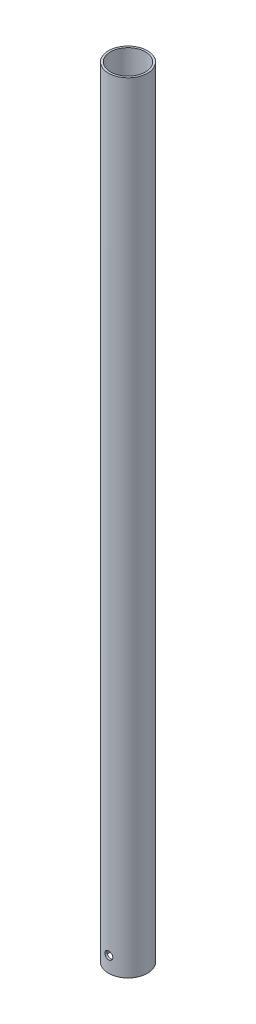
ISO-10303-21;
HEADER;
FILE_DESCRIPTION(('STEP AP214'),'2;1');
FILE_NAME('part.step','',(''),(''),'','','');
FILE_SCHEMA(('AUTOMOTIVE_DESIGN { 1 0 10303 214 1 1 1 1 }'));
ENDSEC;
DATA;
#1=APPLICATION_CONTEXT('core data for automotive mechanical design processes');
#2=APPLICATION_PROTOCOL_DEFINITION('international standard','automotive_design',2000,#1);
#3=PRODUCT_CONTEXT('',#1,'mechanical');
#4=PRODUCT('Part','Part','',(#3));
#5=PRODUCT_RELATED_PRODUCT_CATEGORY('part','',(#4));
#6=PRODUCT_DEFINITION_FORMATION('','',#4);
#7=PRODUCT_DEFINITION_CONTEXT('part definition',#1,'design');
#8=PRODUCT_DEFINITION('design','',#6,#7);
#9=PRODUCT_DEFINITION_SHAPE('','',#8);
#10=(LENGTH_UNIT() NAMED_UNIT(*) SI_UNIT(.MILLI.,.METRE.));
#11=(NAMED_UNIT(*) PLANE_ANGLE_UNIT() SI_UNIT($,.RADIAN.));
#12=(NAMED_UNIT(*) SI_UNIT($,.STERADIAN.) SOLID_ANGLE_UNIT());
#13=UNCERTAINTY_MEASURE_WITH_UNIT(LENGTH_MEASURE(1.E-05),#10,'distance_accuracy_value','');
#14=(GEOMETRIC_REPRESENTATION_CONTEXT(3) GLOBAL_UNCERTAINTY_ASSIGNED_CONTEXT((#13)) GLOBAL_UNIT_ASSIGNED_CONTEXT((#10,
#11,#12)) REPRESENTATION_CONTEXT('',''));
#15=CARTESIAN_POINT('',(0.,0.,0.));
#16=DIRECTION('',(0.,0.,1.));
#17=DIRECTION('',(1.,0.,0.));
#18=AXIS2_PLACEMENT_3D('',#15,#16,#17);
#19=CARTESIAN_POINT('',(0.,635.,0.));
#20=DIRECTION('',(0.,1.,0.));
#21=DIRECTION('',(0.,0.,1.));
#22=AXIS2_PLACEMENT_3D('',#19,#20,#21);
#23=PLANE('',#22);
#24=CARTESIAN_POINT('',(0.,635.,0.));
#25=DIRECTION('',(0.,1.,0.));
#26=DIRECTION('',(0.,0.,1.));
#27=AXIS2_PLACEMENT_3D('',#24,#25,#26);
#28=CIRCLE('',#27,15.875);
#29=CARTESIAN_POINT('',(0.,635.,15.875));
#30=VERTEX_POINT('',#29);
#31=EDGE_CURVE('E10',#30,#30,#28,.T.);
#32=ORIENTED_EDGE('',*,*,#31,.T.);
#33=EDGE_LOOP('',(#32));
#34=FACE_BOUND('',#33,.T.);
#35=CARTESIAN_POINT('',(0.,635.,0.));
#36=DIRECTION('',(0.,1.,0.));
#37=DIRECTION('',(0.,0.,1.));
#38=AXIS2_PLACEMENT_3D('',#35,#36,#37);
#39=CIRCLE('',#38,14.224);
#40=CARTESIAN_POINT('',(0.,635.,14.224));
#41=VERTEX_POINT('',#40);
#42=EDGE_CURVE('E63',#41,#41,#39,.T.);
#43=ORIENTED_EDGE('',*,*,#42,.F.);
#44=EDGE_LOOP('',(#43));
#45=FACE_BOUND('',#44,.T.);
#46=ADVANCED_FACE('F38',(#34,#45),#23,.T.);
#47=CARTESIAN_POINT('',(0.,0.,0.));
#48=DIRECTION('',(0.,1.,0.));
#49=DIRECTION('',(0.,0.,1.));
#50=AXIS2_PLACEMENT_3D('',#47,#48,#49);
#51=PLANE('',#50);
#52=CARTESIAN_POINT('',(0.,0.,0.));
#53=DIRECTION('',(0.,1.,0.));
#54=DIRECTION('',(0.,0.,1.));
#55=AXIS2_PLACEMENT_3D('',#52,#53,#54);
#56=CIRCLE('',#55,15.875);
#57=CARTESIAN_POINT('',(0.,0.,15.875));
#58=VERTEX_POINT('',#57);
#59=EDGE_CURVE('E53',#58,#58,#56,.T.);
#60=ORIENTED_EDGE('',*,*,#59,.F.);
#61=EDGE_LOOP('',(#60));
#62=FACE_BOUND('',#61,.T.);
#63=CARTESIAN_POINT('',(0.,0.,0.));
#64=DIRECTION('',(0.,1.,0.));
#65=DIRECTION('',(0.,0.,1.));
#66=AXIS2_PLACEMENT_3D('',#63,#64,#65);
#67=CIRCLE('',#66,14.224);
#68=CARTESIAN_POINT('',(0.,0.,14.224));
#69=VERTEX_POINT('',#68);
#70=EDGE_CURVE('E66',#69,#69,#67,.T.);
#71=ORIENTED_EDGE('',*,*,#70,.T.);
#72=EDGE_LOOP('',(#71));
#73=FACE_BOUND('',#72,.T.);
#74=ADVANCED_FACE('F110',(#62,#73),#51,.F.);
#75=CARTESIAN_POINT('',(0.,635.,0.));
#76=DIRECTION('',(0.,-1.,0.));
#77=DIRECTION('',(0.,0.,-1.));
#78=AXIS2_PLACEMENT_3D('',#75,#76,#77);
#79=CYLINDRICAL_SURFACE('',#78,15.875);
#80=CARTESIAN_POINT('',(0.,15.8750000000002,-15.875));
#81=CARTESIAN_POINT('',(-0.176456679066602,15.8749935087179,-15.8749967481927));
#82=CARTESIAN_POINT('',(-0.352995421139818,15.8602399235778,-15.8720277294088));
#83=CARTESIAN_POINT('',(-0.701082886912621,15.8016622621341,-15.8604701085376));
#84=CARTESIAN_POINT('',(-0.872627533193797,15.7578150908552,-15.8518770420609));
#85=CARTESIAN_POINT('',(-1.20564371921102,15.642458956254,-15.8300308645856));
#86=CARTESIAN_POINT('',(-1.3671247356877,15.5709764880181,-15.8167822181858));
#87=CARTESIAN_POINT('',(-1.67579036464392,15.4024576141516,-15.7870651376212));
#88=CARTESIAN_POINT('',(-1.8229758278657,15.3054227304471,-15.7705968952337));
#89=CARTESIAN_POINT('',(-2.10087679047469,15.0871602806247,-15.7360037492265));
#90=CARTESIAN_POINT('',(-2.23137079492831,14.9656534716329,-15.717861169763));
#91=CARTESIAN_POINT('',(-2.47026670223049,14.7024965779563,-15.6820927293697));
#92=CARTESIAN_POINT('',(-2.5786668796461,14.560844921511,-15.6644669088885));
#93=CARTESIAN_POINT('',(-2.77124081687869,14.2598260871873,-15.6315550275505));
#94=CARTESIAN_POINT('',(-2.85518523089913,14.1003094809466,-15.616291708837));
#95=CARTESIAN_POINT('',(-2.99499549139248,13.769080224662,-15.5900840108548));
#96=CARTESIAN_POINT('',(-3.05086411173823,13.5973687813754,-15.5791392049423));
#97=CARTESIAN_POINT('',(-3.13221782713433,13.2490071445924,-15.5629865667575));
#98=CARTESIAN_POINT('',(-3.15809153101912,13.0724511723484,-15.5577054259032));
#99=CARTESIAN_POINT('',(-3.17992800553043,12.7174313171682,-15.5532574081749));
#100=CARTESIAN_POINT('',(-3.17589383461536,12.5389676311835,-15.5540899061039));
#101=CARTESIAN_POINT('',(-3.13834326959827,12.1880414480333,-15.5617084989549));
#102=CARTESIAN_POINT('',(-3.1052723652744,12.0155290371333,-15.5684046282657));
#103=CARTESIAN_POINT('',(-3.01129028367818,11.678551456595,-15.58685434058));
#104=CARTESIAN_POINT('',(-2.95037777684466,11.5140866716821,-15.5986081651095));
#105=CARTESIAN_POINT('',(-2.80201618816723,11.1965890440911,-15.625940887388));
#106=CARTESIAN_POINT('',(-2.71439053016196,11.0436409823679,-15.6415451015851));
#107=CARTESIAN_POINT('',(-2.51521459926825,10.7544525513363,-15.6748041460447));
#108=CARTESIAN_POINT('',(-2.40366157683293,10.6182141049976,-15.6924592118681));
#109=CARTESIAN_POINT('',(-2.15741229222985,10.3637416471992,-15.7282204244164));
#110=CARTESIAN_POINT('',(-2.02233581184951,10.2458755970473,-15.7463289724462));
#111=CARTESIAN_POINT('',(-1.73413745139688,10.0344165379936,-15.7806659466825));
#112=CARTESIAN_POINT('',(-1.58101533992956,9.94082384039289,-15.7968943487749));
#113=CARTESIAN_POINT('',(-1.26066355334057,9.78050015820753,-15.8256824126082));
#114=CARTESIAN_POINT('',(-1.09341227718333,9.7138112376786,-15.8382363209326));
#115=CARTESIAN_POINT('',(-0.749773000224513,9.60958049492755,-15.8582172353645));
#116=CARTESIAN_POINT('',(-0.57338610898003,9.57203514191623,-15.8656448625169));
#117=CARTESIAN_POINT('',(-0.219644612866205,9.52767825920317,-15.8744498317731));
#118=CARTESIAN_POINT('',(-0.0423555424337057,9.52036316795965,-15.8759262952159));
#119=CARTESIAN_POINT('',(0.310911666061866,9.53531830214142,-15.8729378987808));
#120=CARTESIAN_POINT('',(0.486889877259043,9.55758686444449,-15.8684733728909));
#121=CARTESIAN_POINT('',(0.830915470330267,9.63065883600206,-15.8541666662546));
#122=CARTESIAN_POINT('',(0.999019935979193,9.68120386748084,-15.8443732008336));
#123=CARTESIAN_POINT('',(1.32436751731144,9.80911164493219,-15.8205027779378));
#124=CARTESIAN_POINT('',(1.48160981819919,9.88647640009894,-15.8064254995517));
#125=CARTESIAN_POINT('',(1.78289322645374,10.0669169078179,-15.7753021911821));
#126=CARTESIAN_POINT('',(1.9267491524382,10.1702958297987,-15.7582219263764));
#127=CARTESIAN_POINT('',(2.19525221070348,10.3994241820831,-15.7230678308488));
#128=CARTESIAN_POINT('',(2.31989728085517,10.5251760108196,-15.7049938937463));
#129=CARTESIAN_POINT('',(2.54838387570801,10.7977728922543,-15.6695553879336));
#130=CARTESIAN_POINT('',(2.65187970527448,10.9449099879028,-15.6522058124074));
#131=CARTESIAN_POINT('',(2.83268870866258,11.2547760723075,-15.6204980895292));
#132=CARTESIAN_POINT('',(2.91000293005522,11.417504436896,-15.6061398224986));
#133=CARTESIAN_POINT('',(3.03578209702272,11.7531141815248,-15.5821615135542));
#134=CARTESIAN_POINT('',(3.08439661183659,11.9259376708428,-15.5725169521919));
#135=CARTESIAN_POINT('',(3.15184996891635,12.2775137148336,-15.5590061181468));
#136=CARTESIAN_POINT('',(3.17069269411473,12.4562654932147,-15.5551390919428));
#137=CARTESIAN_POINT('',(3.17792389200421,12.8111531449282,-15.5536630007963));
#138=CARTESIAN_POINT('',(3.16685862712509,12.9872776478433,-15.5559416842603));
#139=CARTESIAN_POINT('',(3.11579356551769,13.3351004884485,-15.5662494581365));
#140=CARTESIAN_POINT('',(3.07579400121052,13.506798861681,-15.5742785023576));
#141=CARTESIAN_POINT('',(2.96823945498418,13.8405479831887,-15.5951321389583));
#142=CARTESIAN_POINT('',(2.90075145882757,14.0026210945952,-15.6079450673479));
#143=CARTESIAN_POINT('',(2.74019849661009,14.3132293133318,-15.6369294504299));
#144=CARTESIAN_POINT('',(2.64713138586025,14.4617632840773,-15.6531011867149));
#145=CARTESIAN_POINT('',(2.43619627944687,14.7437969415772,-15.6873244966124));
#146=CARTESIAN_POINT('',(2.3179337919717,14.8769983297246,-15.705403339883));
#147=CARTESIAN_POINT('',(2.06077937161672,15.1218462025551,-15.7412080994346));
#148=CARTESIAN_POINT('',(1.92188270421184,15.2334877267573,-15.7589339336561));
#149=CARTESIAN_POINT('',(1.62565597235518,15.43314999453,-15.7922541783181));
#150=CARTESIAN_POINT('',(1.46814820806473,15.5209113104141,-15.8078243412111));
#151=CARTESIAN_POINT('',(1.14035319598683,15.6685809392442,-15.8348402214487));
#152=CARTESIAN_POINT('',(0.970077628240425,15.7285143567657,-15.8462896541511));
#153=CARTESIAN_POINT('',(0.666183227332991,15.807219935042,-15.861549829903));
#154=CARTESIAN_POINT('',(0.534294283243752,15.8325921400221,-15.8665641252808));
#155=CARTESIAN_POINT('',(0.26828599254195,15.8664843717378,-15.8732903939416));
#156=CARTESIAN_POINT('',(0.134166717151859,15.8750049355687,-15.8750024724727));
#157=CARTESIAN_POINT('',(0.,15.8750000000002,-15.875));
#158=B_SPLINE_CURVE_WITH_KNOTS('',3,(#80,#81,#82,#83,#84,#85,#86,#87,#88,#89,#90,#91,#92,#93,
#94,#95,#96,#97,#98,#99,#100,#101,#102,#103,#104,#105,#106,#107,#108,#109,#110,#111,#112,#113,
#114,#115,#116,#117,#118,#119,#120,#121,#122,#123,#124,#125,#126,#127,#128,#129,#130,#131,#132,
#133,#134,#135,#136,#137,#138,#139,#140,#141,#142,#143,#144,#145,#146,#147,#148,#149,#150,#151,
#152,#153,#154,#155,#156,#157),.UNSPECIFIED.,.T.,.F.,(4,2,2,2,2,2,2,2,2,2,2,2,2,2,2,2,2,2,2,2,2,
2,2,2,2,2,2,2,2,2,2,2,2,2,2,2,2,2,4),(0.,0.528879214849488,1.05817876594496,1.58697210941985,
2.115733964583,2.6509112276062,3.1861302696729,3.72621794143806,4.26625224234503,
4.79920887703891,5.33211101092891,5.85697733244935,6.38186872130593,6.91030781396408,
7.43880766330205,7.9768145166004,8.51482826938931,9.05367997661527,9.59246639091265,
10.1222408577214,10.6519855431373,11.1769669129355,11.7019876201087,12.2334358465592,
12.7649410799833,13.3045399573904,13.8441172419701,14.380857097789,14.9175269444907,
15.4444611915245,15.9713912058903,16.4970447697862,17.0227424207243,17.5573714205928,
18.0921232814206,18.6324715194515,19.1723313376812,19.5744711154542,19.9765980760291),.UNSPECIFIED.);
#159=CARTESIAN_POINT('',(0.,15.8750000000002,-15.875));
#160=VERTEX_POINT('',#159);
#161=EDGE_CURVE('E93',#160,#160,#158,.T.);
#162=ORIENTED_EDGE('',*,*,#161,.T.);
#163=EDGE_LOOP('',(#162));
#164=FACE_BOUND('',#163,.T.);
#165=CARTESIAN_POINT('',(3.175,12.7,15.5542598666732));
#166=CARTESIAN_POINT('',(3.17499347815399,12.5235831078156,15.554263374096));
#167=CARTESIAN_POINT('',(3.16024632020511,12.3470840709166,15.5572938875313));
#168=CARTESIAN_POINT('',(3.10169650037552,11.9990790461706,15.5690706939298));
#169=CARTESIAN_POINT('',(3.05787058944882,11.8275771682808,15.577821560347));
#170=CARTESIAN_POINT('',(2.94257660981769,11.4946515618504,15.6000092406689));
#171=CARTESIAN_POINT('',(2.87113603493457,11.333217994134,15.6134413924691));
#172=CARTESIAN_POINT('',(2.70271591685386,11.0246323680872,15.6434726335109));
#173=CARTESIAN_POINT('',(2.60573779905866,10.8774795132922,15.6600715459824));
#174=CARTESIAN_POINT('',(2.38753356519967,10.599543812764,15.6948282652925));
#175=CARTESIAN_POINT('',(2.26601545752479,10.4689923084684,15.7130031763326));
#176=CARTESIAN_POINT('',(2.00281155514267,10.2299848308867,15.7487134956075));
#177=CARTESIAN_POINT('',(1.86112434790511,10.1215304064504,15.7662488589439));
#178=CARTESIAN_POINT('',(1.56007230505952,9.92889804402965,15.7988887862576));
#179=CARTESIAN_POINT('',(1.40056415235928,9.84493994363218,15.8139708307692));
#180=CARTESIAN_POINT('',(1.0693531774796,9.70510207487217,15.8398126460553));
#181=CARTESIAN_POINT('',(0.897651498510268,9.64921967821436,15.8505728214008));
#182=CARTESIAN_POINT('',(0.549328255159233,9.56783966025769,15.8664376818573));
#183=CARTESIAN_POINT('',(0.372801322007048,9.54195139621205,15.871615014648));
#184=CARTESIAN_POINT('',(0.0178389547891913,9.52007572791335,15.8759817475794));
#185=CARTESIAN_POINT('',(-0.160596293716089,9.52408544237452,15.8751717247251));
#186=CARTESIAN_POINT('',(-0.511625852360882,9.56159562218438,15.8677113070754));
#187=CARTESIAN_POINT('',(-0.684267155397631,9.59467530250792,15.8611442481154));
#188=CARTESIAN_POINT('',(-1.02149791439245,9.68871897805698,15.8430016248112));
#189=CARTESIAN_POINT('',(-1.18608704789713,9.74968408895919,15.8314258600732));
#190=CARTESIAN_POINT('',(-1.50374179566281,9.89815787746757,15.8044291486337));
#191=CARTESIAN_POINT('',(-1.65672825287512,9.98583140975802,15.7889844295633));
#192=CARTESIAN_POINT('',(-1.94597352060472,10.1851113202262,15.7559524057927));
#193=CARTESIAN_POINT('',(-2.08223040349187,10.2967204522714,15.7383648546533));
#194=CARTESIAN_POINT('',(-2.33664579359472,10.5430117501944,15.7026281185716));
#195=CARTESIAN_POINT('',(-2.45444745512127,10.6780621678664,15.6844744875261));
#196=CARTESIAN_POINT('',(-2.66578871583636,10.9661847047811,15.6499423982607));
#197=CARTESIAN_POINT('',(-2.7593278561356,11.1192571648041,15.6335639736194));
#198=CARTESIAN_POINT('',(-2.91961193699597,11.4395911410342,15.6044280072653));
#199=CARTESIAN_POINT('',(-2.98629910669422,11.6068823222559,15.5916782896427));
#200=CARTESIAN_POINT('',(-3.09051433466757,11.9506089528237,15.5713581232004));
#201=CARTESIAN_POINT('',(-3.12804619327484,12.1270432071906,15.5637869993776));
#202=CARTESIAN_POINT('',(-3.17235206916446,12.480813424147,15.5548164667535));
#203=CARTESIAN_POINT('',(-3.17964140200087,12.6580822984353,15.5533136690646));
#204=CARTESIAN_POINT('',(-3.1646419698866,13.011303108659,15.5563724206211));
#205=CARTESIAN_POINT('',(-3.14235488216376,13.1872551187024,15.5609336259873));
#206=CARTESIAN_POINT('',(-3.06927951063545,13.5311154329278,15.5755096317135));
#207=CARTESIAN_POINT('',(-3.01876657116477,13.6990846891385,15.5854717187103));
#208=CARTESIAN_POINT('',(-2.89096778710455,14.0241759109162,15.6096807869154));
#209=CARTESIAN_POINT('',(-2.81367973703484,14.1812969816334,15.6239281210891));
#210=CARTESIAN_POINT('',(-2.63335815153453,14.4824866240918,15.6553346392947));
#211=CARTESIAN_POINT('',(-2.53000217259525,14.6263583720051,15.6725293567107));
#212=CARTESIAN_POINT('',(-2.30090844177537,14.8949038906029,15.7077957314957));
#213=CARTESIAN_POINT('',(-2.17516838633391,15.0195756829414,15.7258674789812));
#214=CARTESIAN_POINT('',(-1.90256246835581,15.2481361254142,15.7611872313476));
#215=CARTESIAN_POINT('',(-1.75540193410158,15.3516763535137,15.7784183322507));
#216=CARTESIAN_POINT('',(-1.44547557181535,15.5325631737612,15.8098213022087));
#217=CARTESIAN_POINT('',(-1.28271039950139,15.6099108659197,15.823993299728));
#218=CARTESIAN_POINT('',(-0.947111011616247,15.7357091677956,15.8476090864389));
#219=CARTESIAN_POINT('',(-0.774340188292905,15.7843236453684,15.8570796377776));
#220=CARTESIAN_POINT('',(-0.422876518608726,15.8517947113327,15.8703402410208));
#221=CARTESIAN_POINT('',(-0.244184388158104,15.8706548838353,15.8741309770952));
#222=CARTESIAN_POINT('',(0.11072143814399,15.8779431645572,15.8755886594182));
#223=CARTESIAN_POINT('',(0.286924153549236,15.8668951154485,15.8733610189412));
#224=CARTESIAN_POINT('',(0.63490802442718,15.8158372070107,15.8632538830408));
#225=CARTESIAN_POINT('',(0.80668923546806,15.7758277118447,15.8553744586832));
#226=CARTESIAN_POINT('',(1.14062748044057,15.6682154501092,15.8348520730862));
#227=CARTESIAN_POINT('',(1.30280550728751,15.6006756244342,15.8222199826118));
#228=CARTESIAN_POINT('',(1.61360237409076,15.4399861337737,15.7935524274268));
#229=CARTESIAN_POINT('',(1.7622201413129,15.3468344450032,15.7775166937919));
#230=CARTESIAN_POINT('',(2.04426785108627,15.1357984460804,15.7434787732265));
#231=CARTESIAN_POINT('',(2.17741409866462,15.0175393819815,15.7254490360183));
#232=CARTESIAN_POINT('',(2.42215231138325,14.7604154876864,15.6896188273247));
#233=CARTESIAN_POINT('',(2.5337391641883,14.6215457839012,15.6718184111493));
#234=CARTESIAN_POINT('',(2.73333279675369,14.3253481695079,15.6382511318023));
#235=CARTESIAN_POINT('',(2.82107263641243,14.16783754844,15.6225082383864));
#236=CARTESIAN_POINT('',(2.96870135642026,13.8400384448992,15.5951312787636));
#237=CARTESIAN_POINT('',(3.02861550096796,13.6697617171682,15.5834934876682));
#238=CARTESIAN_POINT('',(3.10727451904805,13.3659167039689,15.5679673761266));
#239=CARTESIAN_POINT('',(3.1326261278127,13.2340812930432,15.5628589210387));
#240=CARTESIAN_POINT('',(3.16649105702208,12.9681796943002,15.5560038910759));
#241=CARTESIAN_POINT('',(3.17500495796139,12.8341135835488,15.5542572003013));
#242=CARTESIAN_POINT('',(3.175,12.7,15.5542598666732));
#243=B_SPLINE_CURVE_WITH_KNOTS('',3,(#165,#166,#167,#168,#169,#170,#171,#172,#173,#174,#175,
#176,#177,#178,#179,#180,#181,#182,#183,#184,#185,#186,#187,#188,#189,#190,#191,#192,#193,#194,
#195,#196,#197,#198,#199,#200,#201,#202,#203,#204,#205,#206,#207,#208,#209,#210,#211,#212,#213,
#214,#215,#216,#217,#218,#219,#220,#221,#222,#223,#224,#225,#226,#227,#228,#229,#230,#231,#232,
#233,#234,#235,#236,#237,#238,#239,#240,#241,#242),.UNSPECIFIED.,.T.,.F.,(4,2,2,2,2,2,2,2,2,2,2,
2,2,2,2,2,2,2,2,2,2,2,2,2,2,2,2,2,2,2,2,2,2,2,2,2,2,2,4),(0.,0.528759622785433,1.05794250972764,
1.58659988096136,2.11522775093006,2.65056151841286,3.18593279612464,3.72597046388903,
4.26595756682826,4.79882990203779,5.33165088469087,5.8568840708648,6.38213827309156,
6.91070259405812,7.43932776069959,7.97716675970884,8.51501593039636,9.05401615573565,
9.59294611175877,10.1226543102958,10.6523324712774,11.1769316016204,11.7015739537521,
12.233054647841,12.7645900686291,13.3042851050371,13.8439574730058,14.3805215811221,
14.9170210514592,15.4441848029163,15.9713419258945,16.4973005421456,17.0233007302762,
17.5577865768127,18.0923990097505,18.6327700299025,19.1726494591138,19.5746307655116,
19.976598213014),.UNSPECIFIED.);
#244=CARTESIAN_POINT('',(3.175,12.7,15.5542598666732));
#245=VERTEX_POINT('',#244);
#246=EDGE_CURVE('E87',#245,#245,#243,.T.);
#247=ORIENTED_EDGE('',*,*,#246,.T.);
#248=EDGE_LOOP('',(#247));
#249=FACE_BOUND('',#248,.T.);
#250=ORIENTED_EDGE('',*,*,#31,.F.);
#251=EDGE_LOOP('',(#250));
#252=FACE_BOUND('',#251,.T.);
#253=ORIENTED_EDGE('',*,*,#59,.T.);
#254=EDGE_LOOP('',(#253));
#255=FACE_BOUND('',#254,.T.);
#256=ADVANCED_FACE('F40',(#164,#249,#252,#255),#79,.T.);
#257=CARTESIAN_POINT('',(0.,635.,0.));
#258=DIRECTION('',(0.,-1.,0.));
#259=DIRECTION('',(0.,0.,-1.));
#260=AXIS2_PLACEMENT_3D('',#257,#258,#259);
#261=CYLINDRICAL_SURFACE('',#260,14.224);
#262=CARTESIAN_POINT('',(0.,15.8750000000002,-14.224));
#263=CARTESIAN_POINT('',(-0.176002393535751,15.874994118524,-14.2239967694346));
#264=CARTESIAN_POINT('',(-0.352075077079846,15.8603158809704,-14.2207002107504));
#265=CARTESIAN_POINT('',(-0.699213016865243,15.8020553467043,-14.2078681217546));
#266=CARTESIAN_POINT('',(-0.870274709489288,15.7584529775169,-14.1983282588399));
#267=CARTESIAN_POINT('',(-1.20232417162535,15.643782765938,-14.1740709678886));
#268=CARTESIAN_POINT('',(-1.36332246948716,15.5727442056908,-14.1593590613767));
#269=CARTESIAN_POINT('',(-1.67111052149828,15.4053124830605,-14.1263426344137));
#270=CARTESIAN_POINT('',(-1.81790052515191,15.3089197660189,-14.1080381770666));
#271=CARTESIAN_POINT('',(-2.09555703773805,15.0918158481104,-14.0694982487133));
#272=CARTESIAN_POINT('',(-2.22615279490276,14.9707627485617,-14.0492380078032));
#273=CARTESIAN_POINT('',(-2.4653652409271,14.7085080444818,-14.0092431082232));
#274=CARTESIAN_POINT('',(-2.57397990458285,14.5673045854611,-13.989508498127));
#275=CARTESIAN_POINT('',(-2.76735221264674,14.2667419000399,-13.9525543691577));
#276=CARTESIAN_POINT('',(-2.85181963651138,14.1071917083353,-13.9353665527997));
#277=CARTESIAN_POINT('',(-2.99263749811242,13.7757140096027,-13.9058084375542));
#278=CARTESIAN_POINT('',(-3.04899144798773,13.6037880517175,-13.8934375369452));
#279=CARTESIAN_POINT('',(-3.13108392844142,13.2553818775804,-13.8751665373932));
#280=CARTESIAN_POINT('',(-3.15730287611521,13.0790202923081,-13.8691650189887));
#281=CARTESIAN_POINT('',(-3.17987526317274,12.7243074069811,-13.8640078472432));
#282=CARTESIAN_POINT('',(-3.17623253148649,12.5459563649474,-13.8648513162229));
#283=CARTESIAN_POINT('',(-3.13957112341393,12.1959134896846,-13.8731970837772));
#284=CARTESIAN_POINT('',(-3.10711244494672,12.0241595184352,-13.8805724376925));
#285=CARTESIAN_POINT('',(-3.01462856096143,11.6885980398196,-13.9009500388242));
#286=CARTESIAN_POINT('',(-2.9546017514943,11.5247909954289,-13.9139526134369));
#287=CARTESIAN_POINT('',(-2.80817644368965,11.2082088933682,-13.9442435120904));
#288=CARTESIAN_POINT('',(-2.72156427581001,11.0555361008207,-13.9615663388414));
#289=CARTESIAN_POINT('',(-2.52457697380135,10.7666849803959,-13.9985249699224));
#290=CARTESIAN_POINT('',(-2.4141984737016,10.6305089931962,-14.0181611017019));
#291=CARTESIAN_POINT('',(-2.16985602134034,10.3752948709475,-14.0580771514011));
#292=CARTESIAN_POINT('',(-2.03541635383649,10.256712429084,-14.0783616017926));
#293=CARTESIAN_POINT('',(-1.74832693095391,10.0437006508984,-14.1168860609084));
#294=CARTESIAN_POINT('',(-1.59567681871861,9.94927178801007,-14.1351260295549));
#295=CARTESIAN_POINT('',(-1.27593076900027,9.78712776704112,-14.1675694930753));
#296=CARTESIAN_POINT('',(-1.10880256349202,9.71947425404812,-14.181763652489));
#297=CARTESIAN_POINT('',(-0.765162274632478,9.61333893582626,-14.2044470809322));
#298=CARTESIAN_POINT('',(-0.588651618088138,9.57485270857799,-14.2129372147206));
#299=CARTESIAN_POINT('',(-0.235163961409721,9.52881172343443,-14.2231322298485));
#300=CARTESIAN_POINT('',(-0.0582718290341468,9.52063475692354,-14.2249735810845));
#301=CARTESIAN_POINT('',(0.294351016873379,9.53375521584877,-14.2220468361359));
#302=CARTESIAN_POINT('',(0.470081811738303,9.5550505547668,-14.2172792078399));
#303=CARTESIAN_POINT('',(0.813318387280924,9.62599552647107,-14.2017565124434));
#304=CARTESIAN_POINT('',(0.980895405338311,9.67531702540638,-14.1910707714272));
#305=CARTESIAN_POINT('',(1.30539680789893,9.80054861445472,-14.1649087024865));
#306=CARTESIAN_POINT('',(1.46232025795315,9.87646103333087,-14.1494319549921));
#307=CARTESIAN_POINT('',(1.76361978752381,10.0540035721961,-14.1150691111675));
#308=CARTESIAN_POINT('',(1.90777635888992,10.1559969140523,-14.0961360436121));
#309=CARTESIAN_POINT('',(2.17715109854762,10.3823297454571,-14.0570533260398));
#310=CARTESIAN_POINT('',(2.30236669377029,10.5066722660562,-14.0369035112511));
#311=CARTESIAN_POINT('',(2.53277947956259,10.7770341688749,-13.9971841615162));
#312=CARTESIAN_POINT('',(2.63754496941454,10.923424717439,-13.9776332607869));
#313=CARTESIAN_POINT('',(2.8210075895473,11.2320870391669,-13.9417669473512));
#314=CARTESIAN_POINT('',(2.89970586184365,11.3943581161947,-13.9254513929156));
#315=CARTESIAN_POINT('',(3.02825820359808,11.7292976252424,-13.8980628682755));
#316=CARTESIAN_POINT('',(3.07827674990941,11.9019003694647,-13.8869600710764));
#317=CARTESIAN_POINT('',(3.14852646263531,12.2533419207344,-13.8712031560562));
#318=CARTESIAN_POINT('',(3.16876262083769,12.4321796775944,-13.866547957569));
#319=CARTESIAN_POINT('',(3.17865387611002,12.7866569311757,-13.8642834061358));
#320=CARTESIAN_POINT('',(3.16899412013083,12.9622766450337,-13.8665161923045));
#321=CARTESIAN_POINT('',(3.12090439132251,13.3093177076695,-13.8774179340104));
#322=CARTESIAN_POINT('',(3.08247478707647,13.4807391102047,-13.8860868070921));
#323=CARTESIAN_POINT('',(2.97827340567487,13.8139460155664,-13.9088054501368));
#324=CARTESIAN_POINT('',(2.91260527263959,13.9757654147542,-13.9228348073743));
#325=CARTESIAN_POINT('',(2.75587852080635,14.2861904698289,-13.954700871202));
#326=CARTESIAN_POINT('',(2.66481713143021,14.4347946815136,-13.9725379931956));
#327=CARTESIAN_POINT('',(2.45763327331303,14.7179396733241,-14.0104784517952));
#328=CARTESIAN_POINT('',(2.34102422544923,14.8521191522341,-14.0306215452019));
#329=CARTESIAN_POINT('',(2.08703623719436,15.0992301576751,-14.0706414962371));
#330=CARTESIAN_POINT('',(1.94965248989228,15.2121567530425,-14.0905182910871));
#331=CARTESIAN_POINT('',(1.65575680560537,15.4150346256082,-14.1280878257415));
#332=CARTESIAN_POINT('',(1.49900961379527,15.5046516678894,-14.1457470935357));
#333=CARTESIAN_POINT('',(1.1723125359133,15.6561241518201,-14.1765540514907));
#334=CARTESIAN_POINT('',(1.00237364417353,15.718002426406,-14.1897054501597));
#335=CARTESIAN_POINT('',(0.693603057467036,15.8014587264976,-14.207721959129));
#336=CARTESIAN_POINT('',(0.556417461050203,15.8289831756842,-14.2137878716434));
#337=CARTESIAN_POINT('',(0.279502605293262,15.8657557103133,-14.2219280793088));
#338=CARTESIAN_POINT('',(0.139773468065014,15.8750046708135,-14.224002565575));
#339=CARTESIAN_POINT('',(0.,15.8750000000002,-14.224));
#340=B_SPLINE_CURVE_WITH_KNOTS('',3,(#262,#263,#264,#265,#266,#267,#268,#269,#270,#271,#272,
#273,#274,#275,#276,#277,#278,#279,#280,#281,#282,#283,#284,#285,#286,#287,#288,#289,#290,#291,
#292,#293,#294,#295,#296,#297,#298,#299,#300,#301,#302,#303,#304,#305,#306,#307,#308,#309,#310,
#311,#312,#313,#314,#315,#316,#317,#318,#319,#320,#321,#322,#323,#324,#325,#326,#327,#328,#329,
#330,#331,#332,#333,#334,#335,#336,#337,#338,#339),.UNSPECIFIED.,.T.,.F.,(4,2,2,2,2,2,2,2,2,2,2,
2,2,2,2,2,2,2,2,2,2,2,2,2,2,2,2,2,2,2,2,2,2,2,2,2,2,2,4),(0.,0.527495475879183,1.05535740119916,
1.58265749910261,2.10994833568757,2.64511925209307,3.18033945345717,3.7217451527938,
4.26308319885909,4.79566591787046,5.32818034902622,5.85056726405223,6.37298457606669,
6.89971571461283,7.42652150199979,7.96520650620156,8.50390206834802,9.04383075732967,
9.58367757194506,10.1123786625813,10.6410423252677,11.1636402276553,11.6862839092461,
12.2166455226773,12.7470791193998,13.2877224144789,13.8283420206187,14.3658293642955,
14.9032266101456,15.4283998571746,15.9535663760952,16.4767526764226,16.9999960823084,
17.5342387998225,18.0686053216714,18.6102573548643,19.1514627092877,19.5703967994549,
19.9893108299466),.UNSPECIFIED.);
#341=CARTESIAN_POINT('',(0.,15.8750000000002,-14.224));
#342=VERTEX_POINT('',#341);
#343=EDGE_CURVE('E43',#342,#342,#340,.T.);
#344=ORIENTED_EDGE('',*,*,#343,.F.);
#345=EDGE_LOOP('',(#344));
#346=FACE_BOUND('',#345,.T.);
#347=CARTESIAN_POINT('',(3.175,12.7,13.865119941782));
#348=CARTESIAN_POINT('',(3.17499407535695,12.5240591854465,13.8651234945156));
#349=CARTESIAN_POINT('',(3.16032575788681,12.3480479759946,13.8685053207699));
#350=CARTESIAN_POINT('',(3.10210819342643,12.0010376332882,13.8816410745119));
#351=CARTESIAN_POINT('',(3.05853862473354,11.8300421151857,13.8913994855765));
#352=CARTESIAN_POINT('',(2.94396428790258,11.4981328851856,13.9161294021383));
#353=CARTESIAN_POINT('',(2.87299033785441,11.3372080834763,13.9310950498815));
#354=CARTESIAN_POINT('',(2.70571097175899,11.0295442019591,13.9645461096854));
#355=CARTESIAN_POINT('',(2.60940585614378,10.8828049539363,13.9830314800008));
#356=CARTESIAN_POINT('',(2.3923922285483,10.6050954206688,14.0218024220076));
#357=CARTESIAN_POINT('',(2.2713221198961,10.4744109787557,14.0421118258715));
#358=CARTESIAN_POINT('',(2.00899561673468,10.2350261473464,14.0820341003482));
#359=CARTESIAN_POINT('',(1.86773761392418,10.126327511053,14.1016469153105));
#360=CARTESIAN_POINT('',(1.56712290056822,9.93286385241336,14.1382262993735));
#361=CARTESIAN_POINT('',(1.40758458781742,9.84837456534889,14.1551614669343));
#362=CARTESIAN_POINT('',(1.0761324959782,9.70751305978816,14.1842078532174));
#363=CARTESIAN_POINT('',(0.904220166910252,9.65113755296193,14.1963196360738));
#364=CARTESIAN_POINT('',(0.555873288731497,9.56900518717684,14.2141861616249));
#365=CARTESIAN_POINT('',(0.379558095007369,9.54276431414988,14.2200412871429));
#366=CARTESIAN_POINT('',(0.0249373469486732,9.52013197522174,14.2250828546405));
#367=CARTESIAN_POINT('',(-0.153367968120957,9.52373695885756,14.2242700898324));
#368=CARTESIAN_POINT('',(-0.503568139008635,9.56033519328935,14.2161439010455));
#369=CARTESIAN_POINT('',(-0.675520600298362,9.59280664283349,14.2089459038672));
#370=CARTESIAN_POINT('',(-1.0114723037277,9.68538358045552,14.1889899180731));
#371=CARTESIAN_POINT('',(-1.17547117624584,9.74549035145226,14.1762316713344));
#372=CARTESIAN_POINT('',(-1.4922988253321,9.89208784818175,14.1464043121052));
#373=CARTESIAN_POINT('',(-1.64503372633016,9.97877470677103,14.1293033215994));
#374=CARTESIAN_POINT('',(-1.93397811315378,10.1759250868109,14.0926629151541));
#375=CARTESIAN_POINT('',(-2.07018525670144,10.286391972176,14.0731231543915));
#376=CARTESIAN_POINT('',(-2.32531252235382,10.5308017460151,14.0332517835942));
#377=CARTESIAN_POINT('',(-2.44379434012679,10.665201270429,14.0129121892103));
#378=CARTESIAN_POINT('',(-2.65662160056897,10.952173023543,13.9741287627658));
#379=CARTESIAN_POINT('',(-2.75096633290572,11.1047457868713,13.9556849865069));
#380=CARTESIAN_POINT('',(-2.91304744496858,11.4244619520301,13.9227592349351));
#381=CARTESIAN_POINT('',(-2.98069794827455,11.5916502994479,13.9082900908072));
#382=CARTESIAN_POINT('',(-3.08680927281865,11.9354225460457,13.8851274787673));
#383=CARTESIAN_POINT('',(-3.12527493761101,12.1120048809795,13.8764330525054));
#384=CARTESIAN_POINT('',(-3.17123847368995,12.4655394434197,13.8660005623941));
#385=CARTESIAN_POINT('',(-3.17937588576906,12.642404382571,13.8641188613183));
#386=CARTESIAN_POINT('',(-3.16618605786013,12.9949637285139,13.8671369274071));
#387=CARTESIAN_POINT('',(-3.14486093292812,13.1706582184199,13.8720362077788));
#388=CARTESIAN_POINT('',(-3.07390709641346,13.5136426742416,13.8879282917098));
#389=CARTESIAN_POINT('',(-3.02463333063382,13.6810099399589,13.8988446308658));
#390=CARTESIAN_POINT('',(-2.89956647045562,14.0051126985521,13.9254713670187));
#391=CARTESIAN_POINT('',(-2.82377075177601,14.1618471375034,13.9411822384029));
#392=CARTESIAN_POINT('',(-2.64641218951555,14.4629949200022,13.9759416047062));
#393=CARTESIAN_POINT('',(-2.54445695042475,14.6071713545563,13.995039421953));
#394=CARTESIAN_POINT('',(-2.31818454115649,14.8766035812471,14.0342920314755));
#395=CARTESIAN_POINT('',(-2.19386447301469,15.0018569175139,14.0544469604884));
#396=CARTESIAN_POINT('',(-1.92349169014137,15.2323844626081,14.0940181443895));
#397=CARTESIAN_POINT('',(-1.77706267267127,15.337221761786,14.1134123502848));
#398=CARTESIAN_POINT('',(-1.46830102978602,15.520810341393,14.1488649544606));
#399=CARTESIAN_POINT('',(-1.30596916342601,15.599562866083,14.1649235118401));
#400=CARTESIAN_POINT('',(-0.971041602397469,15.7281452442169,14.1918028074616));
#401=CARTESIAN_POINT('',(-0.798520696556261,15.7781625037547,14.2026574062323));
#402=CARTESIAN_POINT('',(-0.447254420112704,15.8484372394437,14.2180524436401));
#403=CARTESIAN_POINT('',(-0.268509998194935,15.8686992311973,14.2225938403511));
#404=CARTESIAN_POINT('',(0.0859878905578437,15.8786782160152,14.2248208784312));
#405=CARTESIAN_POINT('',(0.261722420618558,15.8690464447284,14.222652691134));
#406=CARTESIAN_POINT('',(0.60900068507653,15.8209727343567,14.2120188433531));
#407=CARTESIAN_POINT('',(0.78054450089811,15.7825313554942,14.2035533053258));
#408=CARTESIAN_POINT('',(1.11404370718679,15.6782471297974,14.1812884183127));
#409=CARTESIAN_POINT('',(1.27603040277882,15.6125001546235,14.1675077430625));
#410=CARTESIAN_POINT('',(1.58675803995834,15.4555632125078,14.1360811874271));
#411=CARTESIAN_POINT('',(1.73549763705238,15.3643706668811,14.1184349153365));
#412=CARTESIAN_POINT('',(2.01867396695438,15.1570263354874,14.0807655756531));
#413=CARTESIAN_POINT('',(2.15277162854096,15.0404186883009,14.0607025685329));
#414=CARTESIAN_POINT('',(2.39971824165828,14.7864691557445,14.0206709733789));
#415=CARTESIAN_POINT('',(2.51256203460041,14.6491222512257,14.0007024094114));
#416=CARTESIAN_POINT('',(2.71533014635572,14.3552708478172,13.962806852764));
#417=CARTESIAN_POINT('',(2.80491005566962,14.1985242297813,13.9449124975013));
#418=CARTESIAN_POINT('',(2.9563132665573,13.8718326574277,13.9136052259768));
#419=CARTESIAN_POINT('',(3.01815962413209,13.7018988045801,13.9001885895919));
#420=CARTESIAN_POINT('',(3.10154296882424,13.393208417976,13.8817854126926));
#421=CARTESIAN_POINT('',(3.1290355936315,13.256102339676,13.8755780609757));
#422=CARTESIAN_POINT('',(3.16576597865214,12.9793455436815,13.867244022989));
#423=CARTESIAN_POINT('',(3.17500470409769,12.8396949609299,13.8651171209528));
#424=CARTESIAN_POINT('',(3.175,12.7,13.865119941782));
#425=B_SPLINE_CURVE_WITH_KNOTS('',3,(#347,#348,#349,#350,#351,#352,#353,#354,#355,#356,#357,
#358,#359,#360,#361,#362,#363,#364,#365,#366,#367,#368,#369,#370,#371,#372,#373,#374,#375,#376,
#377,#378,#379,#380,#381,#382,#383,#384,#385,#386,#387,#388,#389,#390,#391,#392,#393,#394,#395,
#396,#397,#398,#399,#400,#401,#402,#403,#404,#405,#406,#407,#408,#409,#410,#411,#412,#413,#414,
#415,#416,#417,#418,#419,#420,#421,#422,#423,#424),.UNSPECIFIED.,.T.,.F.,(4,2,2,2,2,2,2,2,2,2,2,
2,2,2,2,2,2,2,2,2,2,2,2,2,2,2,2,2,2,2,2,2,2,2,2,2,2,2,4),(0.,0.527310340388299,1.0549918487542,
1.58208166362553,2.1091652274018,2.64457830603296,3.18003406301586,3.72136585795696,
4.26263432113342,4.79508182884534,5.32746599751377,5.85041795650879,6.37339419503607,
6.90032629927442,7.42733299218698,7.96575385692393,8.50419056507504,9.04434559302815,
9.58441095652092,10.1130211983425,10.6415934942739,11.163598617601,11.6856554066451,
12.2160544860429,12.7465223424565,13.2873276883152,13.8281072336863,14.3653186634415,
14.9024485585901,15.4279598445634,15.953460911876,16.4771323046345,17.0008567861743,
17.5348877406852,18.069048144851,18.6107158620307,19.1519324307216,19.5706328501584,
19.9893111289047),.UNSPECIFIED.);
#426=CARTESIAN_POINT('',(3.175,12.7,13.865119941782));
#427=VERTEX_POINT('',#426);
#428=EDGE_CURVE('E68',#427,#427,#425,.T.);
#429=ORIENTED_EDGE('',*,*,#428,.F.);
#430=EDGE_LOOP('',(#429));
#431=FACE_BOUND('',#430,.T.);
#432=ORIENTED_EDGE('',*,*,#42,.T.);
#433=EDGE_LOOP('',(#432));
#434=FACE_BOUND('',#433,.T.);
#435=ORIENTED_EDGE('',*,*,#70,.F.);
#436=EDGE_LOOP('',(#435));
#437=FACE_BOUND('',#436,.T.);
#438=ADVANCED_FACE('F74',(#346,#431,#434,#437),#261,.F.);
#439=CARTESIAN_POINT('',(0.,12.7,-15.875));
#440=DIRECTION('',(0.,0.,1.));
#441=DIRECTION('',(1.,0.,0.));
#442=AXIS2_PLACEMENT_3D('',#439,#440,#441);
#443=CYLINDRICAL_SURFACE('',#442,3.175);
#444=ORIENTED_EDGE('',*,*,#428,.T.);
#445=EDGE_LOOP('',(#444));
#446=FACE_BOUND('',#445,.T.);
#447=ORIENTED_EDGE('',*,*,#246,.F.);
#448=EDGE_LOOP('',(#447));
#449=FACE_BOUND('',#448,.T.);
#450=ADVANCED_FACE('F80',(#446,#449),#443,.F.);
#451=ORIENTED_EDGE('',*,*,#343,.T.);
#452=EDGE_LOOP('',(#451));
#453=FACE_BOUND('',#452,.T.);
#454=ORIENTED_EDGE('',*,*,#161,.F.);
#455=EDGE_LOOP('',(#454));
#456=FACE_BOUND('',#455,.T.);
#457=ADVANCED_FACE('F77',(#453,#456),#443,.F.);
#458=CLOSED_SHELL('',(#46,#74,#256,#438,#450,#457));
#459=MANIFOLD_SOLID_BREP('B2',#458);
#460=ADVANCED_BREP_SHAPE_REPRESENTATION('',(#18,#459),#14);
#461=SHAPE_DEFINITION_REPRESENTATION(#9,#460);
ENDSEC;
END-ISO-10303-21;
